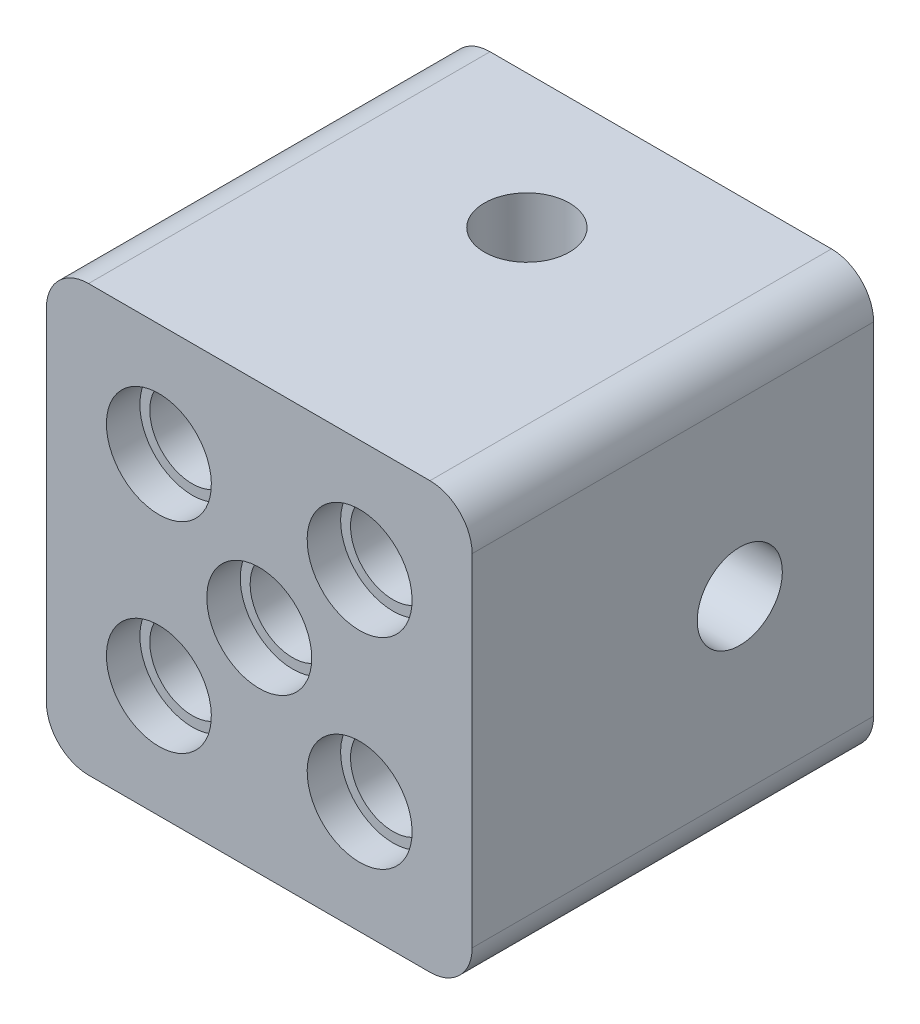
ISO-10303-21;
HEADER;
FILE_DESCRIPTION(('STEP AP214'),'2;1');
FILE_NAME('part.step','',(''),(''),'','','');
FILE_SCHEMA(('AUTOMOTIVE_DESIGN { 1 0 10303 214 1 1 1 1 }'));
ENDSEC;
DATA;
#1=APPLICATION_CONTEXT('core data for automotive mechanical design processes');
#2=APPLICATION_PROTOCOL_DEFINITION('international standard','automotive_design',2000,#1);
#3=PRODUCT_CONTEXT('',#1,'mechanical');
#4=PRODUCT('Part','Part','',(#3));
#5=PRODUCT_RELATED_PRODUCT_CATEGORY('part','',(#4));
#6=PRODUCT_DEFINITION_FORMATION('','',#4);
#7=PRODUCT_DEFINITION_CONTEXT('part definition',#1,'design');
#8=PRODUCT_DEFINITION('design','',#6,#7);
#9=PRODUCT_DEFINITION_SHAPE('','',#8);
#10=(LENGTH_UNIT() NAMED_UNIT(*) SI_UNIT(.MILLI.,.METRE.));
#11=(NAMED_UNIT(*) PLANE_ANGLE_UNIT() SI_UNIT($,.RADIAN.));
#12=(NAMED_UNIT(*) SI_UNIT($,.STERADIAN.) SOLID_ANGLE_UNIT());
#13=UNCERTAINTY_MEASURE_WITH_UNIT(LENGTH_MEASURE(1.E-05),#10,'distance_accuracy_value','');
#14=(GEOMETRIC_REPRESENTATION_CONTEXT(3) GLOBAL_UNCERTAINTY_ASSIGNED_CONTEXT((#13)) GLOBAL_UNIT_ASSIGNED_CONTEXT((#10,
#11,#12)) REPRESENTATION_CONTEXT('',''));
#15=CARTESIAN_POINT('',(0.,0.,0.));
#16=DIRECTION('',(0.,0.,1.));
#17=DIRECTION('',(1.,0.,0.));
#18=AXIS2_PLACEMENT_3D('',#15,#16,#17);
#19=CARTESIAN_POINT('',(0.,0.,-19.05));
#20=DIRECTION('',(0.,0.,-1.));
#21=DIRECTION('',(0.,1.,0.));
#22=AXIS2_PLACEMENT_3D('',#19,#20,#21);
#23=PLANE('',#22);
#24=CARTESIAN_POINT('',(-4.7625,4.7625,-19.05));
#25=DIRECTION('',(0.,0.,-1.));
#26=DIRECTION('',(0.,1.,0.));
#27=AXIS2_PLACEMENT_3D('',#24,#25,#26);
#28=CIRCLE('',#27,2.0193);
#29=CARTESIAN_POINT('',(-4.7625,6.7818,-19.05));
#30=VERTEX_POINT('',#29);
#31=EDGE_CURVE('E292',#30,#30,#28,.F.);
#32=ORIENTED_EDGE('',*,*,#31,.T.);
#33=EDGE_LOOP('',(#32));
#34=FACE_BOUND('',#33,.T.);
#35=CARTESIAN_POINT('',(4.7625,4.7625,-19.05));
#36=DIRECTION('',(0.,0.,-1.));
#37=DIRECTION('',(0.,1.,0.));
#38=AXIS2_PLACEMENT_3D('',#35,#36,#37);
#39=CIRCLE('',#38,2.0193);
#40=CARTESIAN_POINT('',(4.7625,6.7818,-19.05));
#41=VERTEX_POINT('',#40);
#42=EDGE_CURVE('E355',#41,#41,#39,.F.);
#43=ORIENTED_EDGE('',*,*,#42,.T.);
#44=EDGE_LOOP('',(#43));
#45=FACE_BOUND('',#44,.T.);
#46=CARTESIAN_POINT('',(-4.7625,-4.7625,-19.05));
#47=DIRECTION('',(0.,0.,-1.));
#48=DIRECTION('',(0.,1.,0.));
#49=AXIS2_PLACEMENT_3D('',#46,#47,#48);
#50=CIRCLE('',#49,2.0193);
#51=CARTESIAN_POINT('',(-4.7625,-2.7432,-19.05));
#52=VERTEX_POINT('',#51);
#53=EDGE_CURVE('E359',#52,#52,#50,.F.);
#54=ORIENTED_EDGE('',*,*,#53,.T.);
#55=EDGE_LOOP('',(#54));
#56=FACE_BOUND('',#55,.T.);
#57=CARTESIAN_POINT('',(4.7625,-4.7625,-19.05));
#58=DIRECTION('',(0.,0.,-1.));
#59=DIRECTION('',(0.,1.,0.));
#60=AXIS2_PLACEMENT_3D('',#57,#58,#59);
#61=CIRCLE('',#60,2.0193);
#62=CARTESIAN_POINT('',(4.7625,-2.7432,-19.05));
#63=VERTEX_POINT('',#62);
#64=EDGE_CURVE('E363',#63,#63,#61,.F.);
#65=ORIENTED_EDGE('',*,*,#64,.T.);
#66=EDGE_LOOP('',(#65));
#67=FACE_BOUND('',#66,.T.);
#68=CARTESIAN_POINT('',(0.,0.,-19.05));
#69=DIRECTION('',(0.,0.,-1.));
#70=DIRECTION('',(0.,1.,0.));
#71=AXIS2_PLACEMENT_3D('',#68,#69,#70);
#72=CIRCLE('',#71,2.0193);
#73=CARTESIAN_POINT('',(0.,2.0193,-19.05));
#74=VERTEX_POINT('',#73);
#75=EDGE_CURVE('E351',#74,#74,#72,.F.);
#76=ORIENTED_EDGE('',*,*,#75,.T.);
#77=EDGE_LOOP('',(#76));
#78=FACE_BOUND('',#77,.T.);
#79=DIRECTION('',(0.,1.,0.));
#80=VECTOR('',#79,1.);
#81=CARTESIAN_POINT('',(-10.1,0.,-19.05));
#82=LINE('',#81,#80);
#83=CARTESIAN_POINT('',(-10.1,-8.09999999999999,-19.05));
#84=VERTEX_POINT('',#83);
#85=CARTESIAN_POINT('',(-10.1,8.09999999999999,-19.05));
#86=VERTEX_POINT('',#85);
#87=EDGE_CURVE('E194',#84,#86,#82,.T.);
#88=ORIENTED_EDGE('',*,*,#87,.T.);
#89=CARTESIAN_POINT('',(-8.1,8.1,-19.05));
#90=DIRECTION('',(0.,0.,-1.));
#91=DIRECTION('',(0.,1.,0.));
#92=AXIS2_PLACEMENT_3D('',#89,#90,#91);
#93=CIRCLE('',#92,2.);
#94=CARTESIAN_POINT('',(-8.09999999999999,10.1,-19.05));
#95=VERTEX_POINT('',#94);
#96=EDGE_CURVE('E221',#86,#95,#93,.T.);
#97=ORIENTED_EDGE('',*,*,#96,.T.);
#98=DIRECTION('',(1.,0.,0.));
#99=VECTOR('',#98,1.);
#100=CARTESIAN_POINT('',(0.,10.1,-19.05));
#101=LINE('',#100,#99);
#102=CARTESIAN_POINT('',(8.09999999999999,10.1,-19.05));
#103=VERTEX_POINT('',#102);
#104=EDGE_CURVE('E218',#95,#103,#101,.T.);
#105=ORIENTED_EDGE('',*,*,#104,.T.);
#106=CARTESIAN_POINT('',(8.1,8.1,-19.05));
#107=DIRECTION('',(0.,0.,-1.));
#108=DIRECTION('',(0.,1.,0.));
#109=AXIS2_PLACEMENT_3D('',#106,#107,#108);
#110=CIRCLE('',#109,2.);
#111=CARTESIAN_POINT('',(10.1,8.09999999999999,-19.05));
#112=VERTEX_POINT('',#111);
#113=EDGE_CURVE('E212',#103,#112,#110,.T.);
#114=ORIENTED_EDGE('',*,*,#113,.T.);
#115=DIRECTION('',(0.,-1.,0.));
#116=VECTOR('',#115,1.);
#117=CARTESIAN_POINT('',(10.1,0.,-19.05));
#118=LINE('',#117,#116);
#119=CARTESIAN_POINT('',(10.1,-8.09999999999999,-19.05));
#120=VERTEX_POINT('',#119);
#121=EDGE_CURVE('E209',#112,#120,#118,.T.);
#122=ORIENTED_EDGE('',*,*,#121,.T.);
#123=CARTESIAN_POINT('',(8.1,-8.1,-19.05));
#124=DIRECTION('',(0.,0.,-1.));
#125=DIRECTION('',(0.,1.,0.));
#126=AXIS2_PLACEMENT_3D('',#123,#124,#125);
#127=CIRCLE('',#126,2.);
#128=CARTESIAN_POINT('',(8.09999999999999,-10.1,-19.05));
#129=VERTEX_POINT('',#128);
#130=EDGE_CURVE('E203',#120,#129,#127,.T.);
#131=ORIENTED_EDGE('',*,*,#130,.T.);
#132=DIRECTION('',(-1.,0.,0.));
#133=VECTOR('',#132,1.);
#134=CARTESIAN_POINT('',(0.,-10.1,-19.05));
#135=LINE('',#134,#133);
#136=CARTESIAN_POINT('',(-8.09999999999998,-10.1,-19.05));
#137=VERTEX_POINT('',#136);
#138=EDGE_CURVE('E201',#129,#137,#135,.T.);
#139=ORIENTED_EDGE('',*,*,#138,.T.);
#140=CARTESIAN_POINT('',(-8.1,-8.1,-19.05));
#141=DIRECTION('',(0.,0.,-1.));
#142=DIRECTION('',(0.,1.,0.));
#143=AXIS2_PLACEMENT_3D('',#140,#141,#142);
#144=CIRCLE('',#143,2.);
#145=EDGE_CURVE('E146',#137,#84,#144,.T.);
#146=ORIENTED_EDGE('',*,*,#145,.T.);
#147=EDGE_LOOP('',(#88,#97,#105,#114,#122,#131,#139,#146));
#148=FACE_BOUND('',#147,.T.);
#149=ADVANCED_FACE('F52',(#34,#45,#56,#67,#78,#148),#23,.T.);
#150=CARTESIAN_POINT('',(10.9855,0.,-12.7));
#151=DIRECTION('',(-1.,0.,0.));
#152=DIRECTION('',(0.,0.,1.));
#153=AXIS2_PLACEMENT_3D('',#150,#151,#152);
#154=CYLINDRICAL_SURFACE('',#153,2.0193);
#155=CARTESIAN_POINT('',(0.,0.,-12.7));
#156=DIRECTION('',(-0.707106781186548,0.,-0.707106781186548));
#157=DIRECTION('',(-0.707106781186548,0.,0.707106781186548));
#158=AXIS2_PLACEMENT_3D('',#155,#156,#157);
#159=ELLIPSE('',#158,2.85572144649999,2.0193);
#160=CARTESIAN_POINT('',(-1.42786072325,1.42786072325,-11.27213927675));
#161=VERTEX_POINT('',#160);
#162=CARTESIAN_POINT('',(-1.42786072325,-1.42786072324999,-11.27213927675));
#163=VERTEX_POINT('',#162);
#164=EDGE_CURVE('E240',#161,#163,#159,.F.);
#165=ORIENTED_EDGE('',*,*,#164,.T.);
#166=CARTESIAN_POINT('',(0.,0.,-12.7));
#167=DIRECTION('',(0.707106781186548,-0.707106781186548,0.));
#168=DIRECTION('',(-0.707106781186548,-0.707106781186548,0.));
#169=AXIS2_PLACEMENT_3D('',#166,#167,#168);
#170=ELLIPSE('',#169,2.85572144649999,2.0193);
#171=CARTESIAN_POINT('',(-1.42786072325,-1.42786072324999,-14.12786072325));
#172=VERTEX_POINT('',#171);
#173=EDGE_CURVE('E276',#172,#163,#170,.F.);
#174=ORIENTED_EDGE('',*,*,#173,.F.);
#175=CARTESIAN_POINT('',(0.,0.,-12.7));
#176=DIRECTION('',(-0.707106781186548,0.,0.707106781186548));
#177=DIRECTION('',(-0.707106781186548,0.,-0.707106781186548));
#178=AXIS2_PLACEMENT_3D('',#175,#176,#177);
#179=ELLIPSE('',#178,2.85572144649999,2.0193);
#180=CARTESIAN_POINT('',(-1.42786072325,1.42786072325,-14.12786072325));
#181=VERTEX_POINT('',#180);
#182=EDGE_CURVE('E228',#172,#181,#179,.F.);
#183=ORIENTED_EDGE('',*,*,#182,.T.);
#184=CARTESIAN_POINT('',(0.,0.,-12.7));
#185=DIRECTION('',(-0.707106781186548,-0.707106781186548,0.));
#186=DIRECTION('',(0.707106781186548,-0.707106781186548,0.));
#187=AXIS2_PLACEMENT_3D('',#184,#185,#186);
#188=ELLIPSE('',#187,2.85572144649999,2.0193);
#189=EDGE_CURVE('E260',#161,#181,#188,.T.);
#190=ORIENTED_EDGE('',*,*,#189,.F.);
#191=EDGE_LOOP('',(#165,#174,#183,#190));
#192=FACE_BOUND('',#191,.T.);
#193=CARTESIAN_POINT('',(-10.1,0.,-12.7));
#194=DIRECTION('',(-1.,0.,0.));
#195=DIRECTION('',(0.,-1.,0.));
#196=AXIS2_PLACEMENT_3D('',#193,#194,#195);
#197=CIRCLE('',#196,2.0193);
#198=CARTESIAN_POINT('',(-10.1,-2.0193,-12.7));
#199=VERTEX_POINT('',#198);
#200=EDGE_CURVE('E182',#199,#199,#197,.T.);
#201=ORIENTED_EDGE('',*,*,#200,.T.);
#202=EDGE_LOOP('',(#201));
#203=FACE_BOUND('',#202,.T.);
#204=ADVANCED_FACE('F381',(#192,#203),#154,.F.);
#205=CARTESIAN_POINT('',(0.,10.9855,-12.7));
#206=DIRECTION('',(0.,-1.,0.));
#207=DIRECTION('',(-1.,0.,0.));
#208=AXIS2_PLACEMENT_3D('',#205,#206,#207);
#209=CYLINDRICAL_SURFACE('',#208,2.0193);
#210=CARTESIAN_POINT('',(0.,0.,-12.7));
#211=DIRECTION('',(-0.707106781186548,-0.707106781186548,0.));
#212=DIRECTION('',(0.707106781186548,-0.707106781186548,0.));
#213=AXIS2_PLACEMENT_3D('',#210,#211,#212);
#214=ELLIPSE('',#213,2.85572144649999,2.0193);
#215=CARTESIAN_POINT('',(1.42786072325,-1.42786072324999,-11.27213927675));
#216=VERTEX_POINT('',#215);
#217=CARTESIAN_POINT('',(1.42786072325,-1.42786072325,-14.12786072325));
#218=VERTEX_POINT('',#217);
#219=EDGE_CURVE('E284',#216,#218,#214,.F.);
#220=ORIENTED_EDGE('',*,*,#219,.T.);
#221=CARTESIAN_POINT('',(0.,0.,-12.7));
#222=DIRECTION('',(0.,-0.707106781186548,0.707106781186548));
#223=DIRECTION('',(0.,-0.707106781186548,-0.707106781186548));
#224=AXIS2_PLACEMENT_3D('',#221,#222,#223);
#225=ELLIPSE('',#224,2.85572144649999,2.0193);
#226=EDGE_CURVE('E280',#218,#172,#225,.F.);
#227=ORIENTED_EDGE('',*,*,#226,.T.);
#228=ORIENTED_EDGE('',*,*,#173,.T.);
#229=CARTESIAN_POINT('',(0.,0.,-12.7));
#230=DIRECTION('',(0.,-0.707106781186548,-0.707106781186548));
#231=DIRECTION('',(0.,-0.707106781186548,0.707106781186548));
#232=AXIS2_PLACEMENT_3D('',#229,#230,#231);
#233=ELLIPSE('',#232,2.85572144649999,2.0193);
#234=EDGE_CURVE('E272',#163,#216,#233,.F.);
#235=ORIENTED_EDGE('',*,*,#234,.T.);
#236=EDGE_LOOP('',(#220,#227,#228,#235));
#237=FACE_BOUND('',#236,.T.);
#238=CARTESIAN_POINT('',(0.,-10.1,-12.7));
#239=DIRECTION('',(0.,-1.,0.));
#240=DIRECTION('',(0.,0.,-1.));
#241=AXIS2_PLACEMENT_3D('',#238,#239,#240);
#242=CIRCLE('',#241,2.0193);
#243=CARTESIAN_POINT('',(0.,-10.1,-14.7193));
#244=VERTEX_POINT('',#243);
#245=EDGE_CURVE('E198',#244,#244,#242,.T.);
#246=ORIENTED_EDGE('',*,*,#245,.T.);
#247=EDGE_LOOP('',(#246));
#248=FACE_BOUND('',#247,.T.);
#249=ADVANCED_FACE('F385',(#237,#248),#209,.F.);
#250=CARTESIAN_POINT('',(0.,0.,-12.7));
#251=DIRECTION('',(-0.707106781186548,0.,0.707106781186548));
#252=DIRECTION('',(-0.707106781186548,0.,-0.707106781186548));
#253=AXIS2_PLACEMENT_3D('',#250,#251,#252);
#254=ELLIPSE('',#253,2.85572144649999,2.0193);
#255=CARTESIAN_POINT('',(1.42786072325,1.42786072325,-11.27213927675));
#256=VERTEX_POINT('',#255);
#257=EDGE_CURVE('E232',#216,#256,#254,.T.);
#258=ORIENTED_EDGE('',*,*,#257,.T.);
#259=CARTESIAN_POINT('',(0.,0.,-12.7));
#260=DIRECTION('',(0.707106781186548,-0.707106781186548,0.));
#261=DIRECTION('',(-0.707106781186548,-0.707106781186548,0.));
#262=AXIS2_PLACEMENT_3D('',#259,#260,#261);
#263=ELLIPSE('',#262,2.85572144649999,2.0193);
#264=CARTESIAN_POINT('',(1.42786072325,1.42786072325,-14.12786072325));
#265=VERTEX_POINT('',#264);
#266=EDGE_CURVE('E268',#265,#256,#263,.T.);
#267=ORIENTED_EDGE('',*,*,#266,.F.);
#268=CARTESIAN_POINT('',(0.,0.,-12.7));
#269=DIRECTION('',(-0.707106781186548,0.,-0.707106781186548));
#270=DIRECTION('',(-0.707106781186548,0.,0.707106781186548));
#271=AXIS2_PLACEMENT_3D('',#268,#269,#270);
#272=ELLIPSE('',#271,2.85572144649999,2.0193);
#273=EDGE_CURVE('E236',#265,#218,#272,.T.);
#274=ORIENTED_EDGE('',*,*,#273,.T.);
#275=ORIENTED_EDGE('',*,*,#219,.F.);
#276=EDGE_LOOP('',(#258,#267,#274,#275));
#277=FACE_BOUND('',#276,.T.);
#278=CARTESIAN_POINT('',(10.1,0.,-12.7));
#279=DIRECTION('',(1.,0.,0.));
#280=DIRECTION('',(0.,1.,0.));
#281=AXIS2_PLACEMENT_3D('',#278,#279,#280);
#282=CIRCLE('',#281,2.0193);
#283=CARTESIAN_POINT('',(10.1,2.0193,-12.7));
#284=VERTEX_POINT('',#283);
#285=EDGE_CURVE('E206',#284,#284,#282,.T.);
#286=ORIENTED_EDGE('',*,*,#285,.T.);
#287=EDGE_LOOP('',(#286));
#288=FACE_BOUND('',#287,.T.);
#289=ADVANCED_FACE('F389',(#277,#288),#154,.F.);
#290=ORIENTED_EDGE('',*,*,#266,.T.);
#291=CARTESIAN_POINT('',(0.,0.,-12.7));
#292=DIRECTION('',(0.,-0.707106781186548,0.707106781186548));
#293=DIRECTION('',(0.,-0.707106781186548,-0.707106781186548));
#294=AXIS2_PLACEMENT_3D('',#291,#292,#293);
#295=ELLIPSE('',#294,2.85572144649999,2.0193);
#296=EDGE_CURVE('E253',#256,#161,#295,.T.);
#297=ORIENTED_EDGE('',*,*,#296,.T.);
#298=ORIENTED_EDGE('',*,*,#189,.T.);
#299=CARTESIAN_POINT('',(0.,0.,-12.7));
#300=DIRECTION('',(0.,-0.707106781186548,-0.707106781186548));
#301=DIRECTION('',(0.,-0.707106781186548,0.707106781186548));
#302=AXIS2_PLACEMENT_3D('',#299,#300,#301);
#303=ELLIPSE('',#302,2.85572144649999,2.0193);
#304=EDGE_CURVE('E264',#181,#265,#303,.T.);
#305=ORIENTED_EDGE('',*,*,#304,.T.);
#306=EDGE_LOOP('',(#290,#297,#298,#305));
#307=FACE_BOUND('',#306,.T.);
#308=CARTESIAN_POINT('',(0.,10.1,-12.7));
#309=DIRECTION('',(0.,1.,0.));
#310=DIRECTION('',(0.,0.,1.));
#311=AXIS2_PLACEMENT_3D('',#308,#309,#310);
#312=CIRCLE('',#311,2.0193);
#313=CARTESIAN_POINT('',(0.,10.1,-10.6807));
#314=VERTEX_POINT('',#313);
#315=EDGE_CURVE('E215',#314,#314,#312,.T.);
#316=ORIENTED_EDGE('',*,*,#315,.T.);
#317=EDGE_LOOP('',(#316));
#318=FACE_BOUND('',#317,.T.);
#319=ADVANCED_FACE('F392',(#307,#318),#209,.F.);
#320=CARTESIAN_POINT('',(0.,0.,0.));
#321=DIRECTION('',(0.,0.,1.));
#322=DIRECTION('',(1.,0.,0.));
#323=AXIS2_PLACEMENT_3D('',#320,#321,#322);
#324=PLANE('',#323);
#325=CARTESIAN_POINT('',(4.7625,4.7625,0.));
#326=DIRECTION('',(0.,0.,1.));
#327=DIRECTION('',(0.,-1.,0.));
#328=AXIS2_PLACEMENT_3D('',#325,#326,#327);
#329=CIRCLE('',#328,2.4892);
#330=CARTESIAN_POINT('',(4.7625,2.2733,0.));
#331=VERTEX_POINT('',#330);
#332=EDGE_CURVE('E293',#331,#331,#329,.T.);
#333=ORIENTED_EDGE('',*,*,#332,.F.);
#334=EDGE_LOOP('',(#333));
#335=FACE_BOUND('',#334,.T.);
#336=CARTESIAN_POINT('',(-4.7625,-4.7625,0.));
#337=DIRECTION('',(0.,0.,1.));
#338=DIRECTION('',(0.,-1.,0.));
#339=AXIS2_PLACEMENT_3D('',#336,#337,#338);
#340=CIRCLE('',#339,2.4892);
#341=CARTESIAN_POINT('',(-4.7625,-7.2517,0.));
#342=VERTEX_POINT('',#341);
#343=EDGE_CURVE('E328',#342,#342,#340,.T.);
#344=ORIENTED_EDGE('',*,*,#343,.F.);
#345=EDGE_LOOP('',(#344));
#346=FACE_BOUND('',#345,.T.);
#347=CARTESIAN_POINT('',(4.7625,-4.7625,0.));
#348=DIRECTION('',(0.,0.,1.));
#349=DIRECTION('',(0.,-1.,0.));
#350=AXIS2_PLACEMENT_3D('',#347,#348,#349);
#351=CIRCLE('',#350,2.4892);
#352=CARTESIAN_POINT('',(4.7625,-7.2517,0.));
#353=VERTEX_POINT('',#352);
#354=EDGE_CURVE('E62',#353,#353,#351,.T.);
#355=ORIENTED_EDGE('',*,*,#354,.F.);
#356=EDGE_LOOP('',(#355));
#357=FACE_BOUND('',#356,.T.);
#358=CARTESIAN_POINT('',(-4.7625,4.7625,0.));
#359=DIRECTION('',(0.,0.,1.));
#360=DIRECTION('',(0.,-1.,0.));
#361=AXIS2_PLACEMENT_3D('',#358,#359,#360);
#362=CIRCLE('',#361,2.4892);
#363=CARTESIAN_POINT('',(-4.7625,2.2733,0.));
#364=VERTEX_POINT('',#363);
#365=EDGE_CURVE('E338',#364,#364,#362,.T.);
#366=ORIENTED_EDGE('',*,*,#365,.F.);
#367=EDGE_LOOP('',(#366));
#368=FACE_BOUND('',#367,.T.);
#369=CARTESIAN_POINT('',(0.,0.,0.));
#370=DIRECTION('',(0.,0.,1.));
#371=DIRECTION('',(1.,0.,0.));
#372=AXIS2_PLACEMENT_3D('',#369,#370,#371);
#373=CIRCLE('',#372,2.4892);
#374=CARTESIAN_POINT('',(2.4892,0.,0.));
#375=VERTEX_POINT('',#374);
#376=EDGE_CURVE('E13',#375,#375,#373,.T.);
#377=ORIENTED_EDGE('',*,*,#376,.F.);
#378=EDGE_LOOP('',(#377));
#379=FACE_BOUND('',#378,.T.);
#380=DIRECTION('',(-1.,0.,0.));
#381=VECTOR('',#380,1.);
#382=CARTESIAN_POINT('',(-8.09999999999999,10.1,0.));
#383=LINE('',#382,#381);
#384=CARTESIAN_POINT('',(8.09999999999999,10.1,0.));
#385=VERTEX_POINT('',#384);
#386=CARTESIAN_POINT('',(-8.09999999999999,10.1,0.));
#387=VERTEX_POINT('',#386);
#388=EDGE_CURVE('E178',#385,#387,#383,.T.);
#389=ORIENTED_EDGE('',*,*,#388,.T.);
#390=CARTESIAN_POINT('',(-8.1,8.1,0.));
#391=DIRECTION('',(0.,0.,1.));
#392=DIRECTION('',(1.,0.,0.));
#393=AXIS2_PLACEMENT_3D('',#390,#391,#392);
#394=CIRCLE('',#393,2.);
#395=CARTESIAN_POINT('',(-10.1,8.09999999999999,0.));
#396=VERTEX_POINT('',#395);
#397=EDGE_CURVE('E167',#387,#396,#394,.T.);
#398=ORIENTED_EDGE('',*,*,#397,.T.);
#399=DIRECTION('',(0.,-1.,0.));
#400=VECTOR('',#399,1.);
#401=CARTESIAN_POINT('',(-10.1,8.09999999999999,0.));
#402=LINE('',#401,#400);
#403=CARTESIAN_POINT('',(-10.1,-8.09999999999999,0.));
#404=VERTEX_POINT('',#403);
#405=EDGE_CURVE('E165',#396,#404,#402,.T.);
#406=ORIENTED_EDGE('',*,*,#405,.T.);
#407=CARTESIAN_POINT('',(-8.1,-8.1,0.));
#408=DIRECTION('',(0.,0.,1.));
#409=DIRECTION('',(1.,0.,0.));
#410=AXIS2_PLACEMENT_3D('',#407,#408,#409);
#411=CIRCLE('',#410,2.);
#412=CARTESIAN_POINT('',(-8.09999999999998,-10.1,0.));
#413=VERTEX_POINT('',#412);
#414=EDGE_CURVE('E77',#404,#413,#411,.T.);
#415=ORIENTED_EDGE('',*,*,#414,.T.);
#416=DIRECTION('',(1.,0.,0.));
#417=VECTOR('',#416,1.);
#418=CARTESIAN_POINT('',(-8.09999999999998,-10.1,0.));
#419=LINE('',#418,#417);
#420=CARTESIAN_POINT('',(8.09999999999999,-10.1,0.));
#421=VERTEX_POINT('',#420);
#422=EDGE_CURVE('E153',#413,#421,#419,.T.);
#423=ORIENTED_EDGE('',*,*,#422,.T.);
#424=CARTESIAN_POINT('',(8.1,-8.1,0.));
#425=DIRECTION('',(0.,0.,1.));
#426=DIRECTION('',(1.,0.,0.));
#427=AXIS2_PLACEMENT_3D('',#424,#425,#426);
#428=CIRCLE('',#427,2.);
#429=CARTESIAN_POINT('',(10.1,-8.09999999999999,0.));
#430=VERTEX_POINT('',#429);
#431=EDGE_CURVE('E159',#421,#430,#428,.T.);
#432=ORIENTED_EDGE('',*,*,#431,.T.);
#433=DIRECTION('',(0.,1.,0.));
#434=VECTOR('',#433,1.);
#435=CARTESIAN_POINT('',(10.1,8.09999999999999,0.));
#436=LINE('',#435,#434);
#437=CARTESIAN_POINT('',(10.1,8.09999999999999,0.));
#438=VERTEX_POINT('',#437);
#439=EDGE_CURVE('E172',#430,#438,#436,.T.);
#440=ORIENTED_EDGE('',*,*,#439,.T.);
#441=CARTESIAN_POINT('',(8.1,8.1,0.));
#442=DIRECTION('',(0.,0.,1.));
#443=DIRECTION('',(1.,0.,0.));
#444=AXIS2_PLACEMENT_3D('',#441,#442,#443);
#445=CIRCLE('',#444,2.);
#446=EDGE_CURVE('E175',#438,#385,#445,.T.);
#447=ORIENTED_EDGE('',*,*,#446,.T.);
#448=EDGE_LOOP('',(#389,#398,#406,#415,#423,#432,#440,#447));
#449=FACE_BOUND('',#448,.T.);
#450=ADVANCED_FACE('F163',(#335,#346,#357,#368,#379,#449),#324,.T.);
#451=CARTESIAN_POINT('',(-4.7625,4.7625,-1.5875));
#452=DIRECTION('',(0.,0.,1.));
#453=DIRECTION('',(0.,-1.,0.));
#454=AXIS2_PLACEMENT_3D('',#451,#452,#453);
#455=PLANE('',#454);
#456=CARTESIAN_POINT('',(0.,0.,-1.5875));
#457=DIRECTION('',(0.,0.,-1.));
#458=DIRECTION('',(0.,1.,0.));
#459=AXIS2_PLACEMENT_3D('',#456,#457,#458);
#460=CIRCLE('',#459,2.0193);
#461=CARTESIAN_POINT('',(0.,2.0193,-1.5875));
#462=VERTEX_POINT('',#461);
#463=EDGE_CURVE('E224',#462,#462,#460,.T.);
#464=ORIENTED_EDGE('',*,*,#463,.T.);
#465=EDGE_LOOP('',(#464));
#466=FACE_BOUND('',#465,.T.);
#467=CARTESIAN_POINT('',(0.,0.,-1.5875));
#468=DIRECTION('',(0.,0.,1.));
#469=DIRECTION('',(0.,-1.,0.));
#470=AXIS2_PLACEMENT_3D('',#467,#468,#469);
#471=CIRCLE('',#470,2.4892);
#472=CARTESIAN_POINT('',(0.,-2.4892,-1.5875));
#473=VERTEX_POINT('',#472);
#474=EDGE_CURVE('E347',#473,#473,#471,.T.);
#475=ORIENTED_EDGE('',*,*,#474,.T.);
#476=EDGE_LOOP('',(#475));
#477=FACE_BOUND('',#476,.T.);
#478=ADVANCED_FACE('F432',(#466,#477),#455,.T.);
#479=CARTESIAN_POINT('',(4.7625,4.7625,-1.5875));
#480=DIRECTION('',(0.,0.,-1.));
#481=DIRECTION('',(0.,1.,0.));
#482=AXIS2_PLACEMENT_3D('',#479,#480,#481);
#483=CIRCLE('',#482,2.0193);
#484=CARTESIAN_POINT('',(4.7625,6.7818,-1.5875));
#485=VERTEX_POINT('',#484);
#486=EDGE_CURVE('E249',#485,#485,#483,.T.);
#487=ORIENTED_EDGE('',*,*,#486,.T.);
#488=EDGE_LOOP('',(#487));
#489=FACE_BOUND('',#488,.T.);
#490=CARTESIAN_POINT('',(4.7625,4.7625,-1.5875));
#491=DIRECTION('',(0.,0.,1.));
#492=DIRECTION('',(0.,-1.,0.));
#493=AXIS2_PLACEMENT_3D('',#490,#491,#492);
#494=CIRCLE('',#493,2.4892);
#495=CARTESIAN_POINT('',(4.7625,2.2733,-1.5875));
#496=VERTEX_POINT('',#495);
#497=EDGE_CURVE('E299',#496,#496,#494,.T.);
#498=ORIENTED_EDGE('',*,*,#497,.T.);
#499=EDGE_LOOP('',(#498));
#500=FACE_BOUND('',#499,.T.);
#501=ADVANCED_FACE('F429',(#489,#500),#455,.T.);
#502=CARTESIAN_POINT('',(-4.7625,4.7625,-1.5875));
#503=DIRECTION('',(0.,0.,-1.));
#504=DIRECTION('',(0.,1.,0.));
#505=AXIS2_PLACEMENT_3D('',#502,#503,#504);
#506=CIRCLE('',#505,2.0193);
#507=CARTESIAN_POINT('',(-4.7625,6.7818,-1.5875));
#508=VERTEX_POINT('',#507);
#509=EDGE_CURVE('E288',#508,#508,#506,.T.);
#510=ORIENTED_EDGE('',*,*,#509,.T.);
#511=EDGE_LOOP('',(#510));
#512=FACE_BOUND('',#511,.T.);
#513=CARTESIAN_POINT('',(-4.7625,4.7625,-1.5875));
#514=DIRECTION('',(0.,0.,1.));
#515=DIRECTION('',(0.,-1.,0.));
#516=AXIS2_PLACEMENT_3D('',#513,#514,#515);
#517=CIRCLE('',#516,2.4892);
#518=CARTESIAN_POINT('',(-4.7625,2.2733,-1.5875));
#519=VERTEX_POINT('',#518);
#520=EDGE_CURVE('E298',#519,#519,#517,.T.);
#521=ORIENTED_EDGE('',*,*,#520,.T.);
#522=EDGE_LOOP('',(#521));
#523=FACE_BOUND('',#522,.T.);
#524=ADVANCED_FACE('F431',(#512,#523),#455,.T.);
#525=CARTESIAN_POINT('',(-4.7625,-4.7625,-1.5875));
#526=DIRECTION('',(0.,0.,-1.));
#527=DIRECTION('',(0.,1.,0.));
#528=AXIS2_PLACEMENT_3D('',#525,#526,#527);
#529=CIRCLE('',#528,2.0193);
#530=CARTESIAN_POINT('',(-4.7625,-2.7432,-1.5875));
#531=VERTEX_POINT('',#530);
#532=EDGE_CURVE('E248',#531,#531,#529,.T.);
#533=ORIENTED_EDGE('',*,*,#532,.T.);
#534=EDGE_LOOP('',(#533));
#535=FACE_BOUND('',#534,.T.);
#536=CARTESIAN_POINT('',(-4.7625,-4.7625,-1.5875));
#537=DIRECTION('',(0.,0.,1.));
#538=DIRECTION('',(0.,-1.,0.));
#539=AXIS2_PLACEMENT_3D('',#536,#537,#538);
#540=CIRCLE('',#539,2.4892);
#541=CARTESIAN_POINT('',(-4.7625,-7.2517,-1.5875));
#542=VERTEX_POINT('',#541);
#543=EDGE_CURVE('E334',#542,#542,#540,.T.);
#544=ORIENTED_EDGE('',*,*,#543,.T.);
#545=EDGE_LOOP('',(#544));
#546=FACE_BOUND('',#545,.T.);
#547=ADVANCED_FACE('F434',(#535,#546),#455,.T.);
#548=CARTESIAN_POINT('',(4.7625,-4.7625,-1.5875));
#549=DIRECTION('',(0.,0.,-1.));
#550=DIRECTION('',(0.,1.,0.));
#551=AXIS2_PLACEMENT_3D('',#548,#549,#550);
#552=CIRCLE('',#551,2.0193);
#553=CARTESIAN_POINT('',(4.7625,-2.7432,-1.5875));
#554=VERTEX_POINT('',#553);
#555=EDGE_CURVE('E244',#554,#554,#552,.T.);
#556=ORIENTED_EDGE('',*,*,#555,.T.);
#557=EDGE_LOOP('',(#556));
#558=FACE_BOUND('',#557,.T.);
#559=CARTESIAN_POINT('',(4.7625,-4.7625,-1.5875));
#560=DIRECTION('',(0.,0.,1.));
#561=DIRECTION('',(0.,-1.,0.));
#562=AXIS2_PLACEMENT_3D('',#559,#560,#561);
#563=CIRCLE('',#562,2.4892);
#564=CARTESIAN_POINT('',(4.7625,-7.2517,-1.5875));
#565=VERTEX_POINT('',#564);
#566=EDGE_CURVE('E300',#565,#565,#563,.T.);
#567=ORIENTED_EDGE('',*,*,#566,.T.);
#568=EDGE_LOOP('',(#567));
#569=FACE_BOUND('',#568,.T.);
#570=ADVANCED_FACE('F423',(#558,#569),#455,.T.);
#571=CARTESIAN_POINT('',(4.7625,-4.7625,-1.5875));
#572=DIRECTION('',(0.,0.,1.));
#573=DIRECTION('',(0.,-1.,0.));
#574=AXIS2_PLACEMENT_3D('',#571,#572,#573);
#575=CYLINDRICAL_SURFACE('',#574,2.4892);
#576=ORIENTED_EDGE('',*,*,#354,.T.);
#577=EDGE_LOOP('',(#576));
#578=FACE_BOUND('',#577,.T.);
#579=ORIENTED_EDGE('',*,*,#566,.F.);
#580=EDGE_LOOP('',(#579));
#581=FACE_BOUND('',#580,.T.);
#582=ADVANCED_FACE('F420',(#578,#581),#575,.F.);
#583=CARTESIAN_POINT('',(-4.7625,-4.7625,-1.5875));
#584=DIRECTION('',(0.,0.,1.));
#585=DIRECTION('',(0.,-1.,0.));
#586=AXIS2_PLACEMENT_3D('',#583,#584,#585);
#587=CYLINDRICAL_SURFACE('',#586,2.4892);
#588=ORIENTED_EDGE('',*,*,#343,.T.);
#589=EDGE_LOOP('',(#588));
#590=FACE_BOUND('',#589,.T.);
#591=ORIENTED_EDGE('',*,*,#543,.F.);
#592=EDGE_LOOP('',(#591));
#593=FACE_BOUND('',#592,.T.);
#594=ADVANCED_FACE('F418',(#590,#593),#587,.F.);
#595=CARTESIAN_POINT('',(-4.7625,4.7625,-1.5875));
#596=DIRECTION('',(0.,0.,1.));
#597=DIRECTION('',(0.,-1.,0.));
#598=AXIS2_PLACEMENT_3D('',#595,#596,#597);
#599=CYLINDRICAL_SURFACE('',#598,2.4892);
#600=ORIENTED_EDGE('',*,*,#365,.T.);
#601=EDGE_LOOP('',(#600));
#602=FACE_BOUND('',#601,.T.);
#603=ORIENTED_EDGE('',*,*,#520,.F.);
#604=EDGE_LOOP('',(#603));
#605=FACE_BOUND('',#604,.T.);
#606=ADVANCED_FACE('F427',(#602,#605),#599,.F.);
#607=CARTESIAN_POINT('',(4.7625,4.7625,-1.5875));
#608=DIRECTION('',(0.,0.,1.));
#609=DIRECTION('',(0.,-1.,0.));
#610=AXIS2_PLACEMENT_3D('',#607,#608,#609);
#611=CYLINDRICAL_SURFACE('',#610,2.4892);
#612=ORIENTED_EDGE('',*,*,#332,.T.);
#613=EDGE_LOOP('',(#612));
#614=FACE_BOUND('',#613,.T.);
#615=ORIENTED_EDGE('',*,*,#497,.F.);
#616=EDGE_LOOP('',(#615));
#617=FACE_BOUND('',#616,.T.);
#618=ADVANCED_FACE('F376',(#614,#617),#611,.F.);
#619=CARTESIAN_POINT('',(0.,0.,-1.5875));
#620=DIRECTION('',(0.,0.,-1.));
#621=DIRECTION('',(0.,1.,0.));
#622=AXIS2_PLACEMENT_3D('',#619,#620,#621);
#623=CYLINDRICAL_SURFACE('',#622,2.0193);
#624=ORIENTED_EDGE('',*,*,#75,.F.);
#625=EDGE_LOOP('',(#624));
#626=FACE_BOUND('',#625,.T.);
#627=ORIENTED_EDGE('',*,*,#182,.F.);
#628=ORIENTED_EDGE('',*,*,#226,.F.);
#629=ORIENTED_EDGE('',*,*,#273,.F.);
#630=ORIENTED_EDGE('',*,*,#304,.F.);
#631=EDGE_LOOP('',(#627,#628,#629,#630));
#632=FACE_BOUND('',#631,.T.);
#633=ADVANCED_FACE('F372',(#626,#632),#623,.F.);
#634=ORIENTED_EDGE('',*,*,#463,.F.);
#635=EDGE_LOOP('',(#634));
#636=FACE_BOUND('',#635,.T.);
#637=ORIENTED_EDGE('',*,*,#164,.F.);
#638=ORIENTED_EDGE('',*,*,#296,.F.);
#639=ORIENTED_EDGE('',*,*,#257,.F.);
#640=ORIENTED_EDGE('',*,*,#234,.F.);
#641=EDGE_LOOP('',(#637,#638,#639,#640));
#642=FACE_BOUND('',#641,.T.);
#643=ADVANCED_FACE('F375',(#636,#642),#623,.F.);
#644=CARTESIAN_POINT('',(-4.7625,4.7625,-1.5875));
#645=DIRECTION('',(0.,0.,-1.));
#646=DIRECTION('',(0.,1.,0.));
#647=AXIS2_PLACEMENT_3D('',#644,#645,#646);
#648=CYLINDRICAL_SURFACE('',#647,2.0193);
#649=ORIENTED_EDGE('',*,*,#31,.F.);
#650=EDGE_LOOP('',(#649));
#651=FACE_BOUND('',#650,.T.);
#652=ORIENTED_EDGE('',*,*,#509,.F.);
#653=EDGE_LOOP('',(#652));
#654=FACE_BOUND('',#653,.T.);
#655=ADVANCED_FACE('F396',(#651,#654),#648,.F.);
#656=CARTESIAN_POINT('',(4.7625,4.7625,-1.5875));
#657=DIRECTION('',(0.,0.,-1.));
#658=DIRECTION('',(0.,1.,0.));
#659=AXIS2_PLACEMENT_3D('',#656,#657,#658);
#660=CYLINDRICAL_SURFACE('',#659,2.0193);
#661=ORIENTED_EDGE('',*,*,#42,.F.);
#662=EDGE_LOOP('',(#661));
#663=FACE_BOUND('',#662,.T.);
#664=ORIENTED_EDGE('',*,*,#486,.F.);
#665=EDGE_LOOP('',(#664));
#666=FACE_BOUND('',#665,.T.);
#667=ADVANCED_FACE('F402',(#663,#666),#660,.F.);
#668=CARTESIAN_POINT('',(-4.7625,-4.7625,-1.5875));
#669=DIRECTION('',(0.,0.,-1.));
#670=DIRECTION('',(0.,1.,0.));
#671=AXIS2_PLACEMENT_3D('',#668,#669,#670);
#672=CYLINDRICAL_SURFACE('',#671,2.0193);
#673=ORIENTED_EDGE('',*,*,#53,.F.);
#674=EDGE_LOOP('',(#673));
#675=FACE_BOUND('',#674,.T.);
#676=ORIENTED_EDGE('',*,*,#532,.F.);
#677=EDGE_LOOP('',(#676));
#678=FACE_BOUND('',#677,.T.);
#679=ADVANCED_FACE('F467',(#675,#678),#672,.F.);
#680=CARTESIAN_POINT('',(4.7625,-4.7625,-1.5875));
#681=DIRECTION('',(0.,0.,-1.));
#682=DIRECTION('',(0.,1.,0.));
#683=AXIS2_PLACEMENT_3D('',#680,#681,#682);
#684=CYLINDRICAL_SURFACE('',#683,2.0193);
#685=ORIENTED_EDGE('',*,*,#64,.F.);
#686=EDGE_LOOP('',(#685));
#687=FACE_BOUND('',#686,.T.);
#688=ORIENTED_EDGE('',*,*,#555,.F.);
#689=EDGE_LOOP('',(#688));
#690=FACE_BOUND('',#689,.T.);
#691=ADVANCED_FACE('F458',(#687,#690),#684,.F.);
#692=CARTESIAN_POINT('',(0.,0.,-0.254));
#693=DIRECTION('',(0.,0.,1.));
#694=DIRECTION('',(1.,0.,0.));
#695=AXIS2_PLACEMENT_3D('',#692,#693,#694);
#696=CYLINDRICAL_SURFACE('',#695,2.4892);
#697=ORIENTED_EDGE('',*,*,#376,.T.);
#698=EDGE_LOOP('',(#697));
#699=FACE_BOUND('',#698,.T.);
#700=ORIENTED_EDGE('',*,*,#474,.F.);
#701=EDGE_LOOP('',(#700));
#702=FACE_BOUND('',#701,.T.);
#703=ADVANCED_FACE('F54',(#699,#702),#696,.F.);
#704=CARTESIAN_POINT('',(-8.1,8.1,-19.0525));
#705=DIRECTION('',(0.,0.,1.));
#706=DIRECTION('',(1.,0.,0.));
#707=AXIS2_PLACEMENT_3D('',#704,#705,#706);
#708=CYLINDRICAL_SURFACE('',#707,2.);
#709=DIRECTION('',(0.,0.,1.));
#710=VECTOR('',#709,1.);
#711=CARTESIAN_POINT('',(-10.1,8.09999999999999,-19.0525));
#712=LINE('',#711,#710);
#713=EDGE_CURVE('E69',#86,#396,#712,.T.);
#714=ORIENTED_EDGE('',*,*,#713,.T.);
#715=ORIENTED_EDGE('',*,*,#397,.F.);
#716=DIRECTION('',(0.,0.,1.));
#717=VECTOR('',#716,1.);
#718=CARTESIAN_POINT('',(-8.09999999999999,10.1,-19.0525));
#719=LINE('',#718,#717);
#720=EDGE_CURVE('E180',#95,#387,#719,.T.);
#721=ORIENTED_EDGE('',*,*,#720,.F.);
#722=ORIENTED_EDGE('',*,*,#96,.F.);
#723=EDGE_LOOP('',(#714,#715,#721,#722));
#724=FACE_BOUND('',#723,.T.);
#725=ADVANCED_FACE('F457',(#724),#708,.T.);
#726=CARTESIAN_POINT('',(-8.09999999999999,10.1,-19.0525));
#727=DIRECTION('',(0.,1.,0.));
#728=DIRECTION('',(0.,0.,1.));
#729=AXIS2_PLACEMENT_3D('',#726,#727,#728);
#730=PLANE('',#729);
#731=ORIENTED_EDGE('',*,*,#315,.F.);
#732=EDGE_LOOP('',(#731));
#733=FACE_BOUND('',#732,.T.);
#734=ORIENTED_EDGE('',*,*,#720,.T.);
#735=ORIENTED_EDGE('',*,*,#388,.F.);
#736=DIRECTION('',(0.,0.,1.));
#737=VECTOR('',#736,1.);
#738=CARTESIAN_POINT('',(8.09999999999999,10.1,-19.0525));
#739=LINE('',#738,#737);
#740=EDGE_CURVE('E183',#103,#385,#739,.T.);
#741=ORIENTED_EDGE('',*,*,#740,.F.);
#742=ORIENTED_EDGE('',*,*,#104,.F.);
#743=EDGE_LOOP('',(#734,#735,#741,#742));
#744=FACE_BOUND('',#743,.T.);
#745=ADVANCED_FACE('F464',(#733,#744),#730,.T.);
#746=CARTESIAN_POINT('',(8.1,8.1,-19.0525));
#747=DIRECTION('',(0.,0.,1.));
#748=DIRECTION('',(1.,0.,0.));
#749=AXIS2_PLACEMENT_3D('',#746,#747,#748);
#750=CYLINDRICAL_SURFACE('',#749,2.);
#751=ORIENTED_EDGE('',*,*,#740,.T.);
#752=ORIENTED_EDGE('',*,*,#446,.F.);
#753=DIRECTION('',(0.,0.,1.));
#754=VECTOR('',#753,1.);
#755=CARTESIAN_POINT('',(10.1,8.09999999999999,-19.0525));
#756=LINE('',#755,#754);
#757=EDGE_CURVE('E185',#112,#438,#756,.T.);
#758=ORIENTED_EDGE('',*,*,#757,.F.);
#759=ORIENTED_EDGE('',*,*,#113,.F.);
#760=EDGE_LOOP('',(#751,#752,#758,#759));
#761=FACE_BOUND('',#760,.T.);
#762=ADVANCED_FACE('F655',(#761),#750,.T.);
#763=CARTESIAN_POINT('',(10.1,8.09999999999999,-19.0525));
#764=DIRECTION('',(1.,0.,0.));
#765=DIRECTION('',(0.,1.,0.));
#766=AXIS2_PLACEMENT_3D('',#763,#764,#765);
#767=PLANE('',#766);
#768=ORIENTED_EDGE('',*,*,#285,.F.);
#769=EDGE_LOOP('',(#768));
#770=FACE_BOUND('',#769,.T.);
#771=ORIENTED_EDGE('',*,*,#757,.T.);
#772=ORIENTED_EDGE('',*,*,#439,.F.);
#773=DIRECTION('',(0.,0.,1.));
#774=VECTOR('',#773,1.);
#775=CARTESIAN_POINT('',(10.1,-8.09999999999999,-19.0525));
#776=LINE('',#775,#774);
#777=EDGE_CURVE('E187',#120,#430,#776,.T.);
#778=ORIENTED_EDGE('',*,*,#777,.F.);
#779=ORIENTED_EDGE('',*,*,#121,.F.);
#780=EDGE_LOOP('',(#771,#772,#778,#779));
#781=FACE_BOUND('',#780,.T.);
#782=ADVANCED_FACE('F665',(#770,#781),#767,.T.);
#783=CARTESIAN_POINT('',(8.1,-8.1,-19.0525));
#784=DIRECTION('',(0.,0.,1.));
#785=DIRECTION('',(1.,0.,0.));
#786=AXIS2_PLACEMENT_3D('',#783,#784,#785);
#787=CYLINDRICAL_SURFACE('',#786,2.);
#788=ORIENTED_EDGE('',*,*,#777,.T.);
#789=ORIENTED_EDGE('',*,*,#431,.F.);
#790=DIRECTION('',(0.,0.,1.));
#791=VECTOR('',#790,1.);
#792=CARTESIAN_POINT('',(8.09999999999999,-10.1,-19.0525));
#793=LINE('',#792,#791);
#794=EDGE_CURVE('E149',#129,#421,#793,.T.);
#795=ORIENTED_EDGE('',*,*,#794,.F.);
#796=ORIENTED_EDGE('',*,*,#130,.F.);
#797=EDGE_LOOP('',(#788,#789,#795,#796));
#798=FACE_BOUND('',#797,.T.);
#799=ADVANCED_FACE('F675',(#798),#787,.T.);
#800=CARTESIAN_POINT('',(-8.09999999999998,-10.1,-19.0525));
#801=DIRECTION('',(0.,-1.,0.));
#802=DIRECTION('',(0.,0.,-1.));
#803=AXIS2_PLACEMENT_3D('',#800,#801,#802);
#804=PLANE('',#803);
#805=ORIENTED_EDGE('',*,*,#245,.F.);
#806=EDGE_LOOP('',(#805));
#807=FACE_BOUND('',#806,.T.);
#808=ORIENTED_EDGE('',*,*,#794,.T.);
#809=ORIENTED_EDGE('',*,*,#422,.F.);
#810=DIRECTION('',(0.,0.,1.));
#811=VECTOR('',#810,1.);
#812=CARTESIAN_POINT('',(-8.09999999999998,-10.1,-19.0525));
#813=LINE('',#812,#811);
#814=EDGE_CURVE('E142',#137,#413,#813,.T.);
#815=ORIENTED_EDGE('',*,*,#814,.F.);
#816=ORIENTED_EDGE('',*,*,#138,.F.);
#817=EDGE_LOOP('',(#808,#809,#815,#816));
#818=FACE_BOUND('',#817,.T.);
#819=ADVANCED_FACE('F154',(#807,#818),#804,.T.);
#820=CARTESIAN_POINT('',(-8.1,-8.1,-19.0525));
#821=DIRECTION('',(0.,0.,1.));
#822=DIRECTION('',(1.,0.,0.));
#823=AXIS2_PLACEMENT_3D('',#820,#821,#822);
#824=CYLINDRICAL_SURFACE('',#823,2.);
#825=ORIENTED_EDGE('',*,*,#814,.T.);
#826=ORIENTED_EDGE('',*,*,#414,.F.);
#827=DIRECTION('',(0.,0.,1.));
#828=VECTOR('',#827,1.);
#829=CARTESIAN_POINT('',(-10.1,-8.09999999999999,-19.0525));
#830=LINE('',#829,#828);
#831=EDGE_CURVE('E150',#84,#404,#830,.T.);
#832=ORIENTED_EDGE('',*,*,#831,.F.);
#833=ORIENTED_EDGE('',*,*,#145,.F.);
#834=EDGE_LOOP('',(#825,#826,#832,#833));
#835=FACE_BOUND('',#834,.T.);
#836=ADVANCED_FACE('F144',(#835),#824,.T.);
#837=CARTESIAN_POINT('',(-10.1,8.09999999999999,-19.0525));
#838=DIRECTION('',(-1.,0.,0.));
#839=DIRECTION('',(0.,-1.,0.));
#840=AXIS2_PLACEMENT_3D('',#837,#838,#839);
#841=PLANE('',#840);
#842=ORIENTED_EDGE('',*,*,#200,.F.);
#843=EDGE_LOOP('',(#842));
#844=FACE_BOUND('',#843,.T.);
#845=ORIENTED_EDGE('',*,*,#831,.T.);
#846=ORIENTED_EDGE('',*,*,#405,.F.);
#847=ORIENTED_EDGE('',*,*,#713,.F.);
#848=ORIENTED_EDGE('',*,*,#87,.F.);
#849=EDGE_LOOP('',(#845,#846,#847,#848));
#850=FACE_BOUND('',#849,.T.);
#851=ADVANCED_FACE('F703',(#844,#850),#841,.T.);
#852=CLOSED_SHELL('',(#149,#204,#249,#289,#319,#450,#478,#501,#524,#547,#570,#582,#594,#606,
#618,#633,#643,#655,#667,#679,#691,#703,#725,#745,#762,#782,#799,#819,#836,#851));
#853=MANIFOLD_SOLID_BREP('B2',#852);
#854=ADVANCED_BREP_SHAPE_REPRESENTATION('',(#18,#853),#14);
#855=SHAPE_DEFINITION_REPRESENTATION(#9,#854);
ENDSEC;
END-ISO-10303-21;
